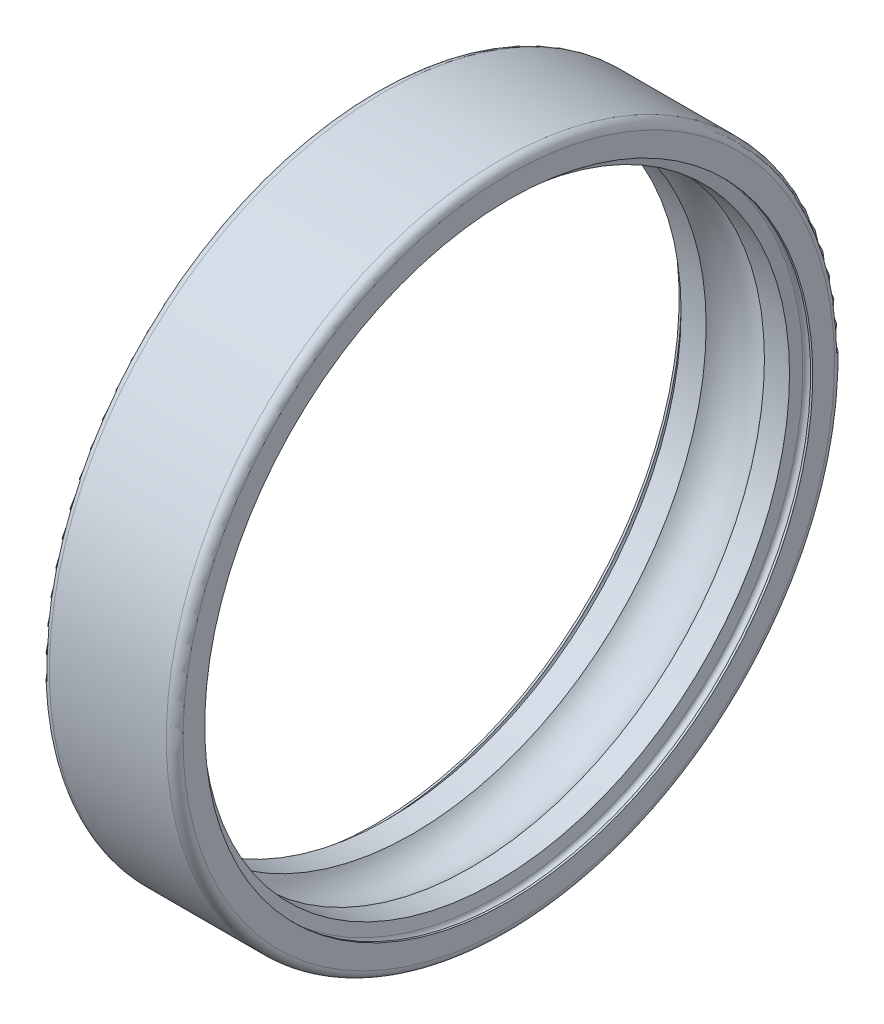
ISO-10303-21;
HEADER;
FILE_DESCRIPTION(('STEP AP214'),'2;1');
FILE_NAME('part.step','',(''),(''),'','','');
FILE_SCHEMA(('AUTOMOTIVE_DESIGN { 1 0 10303 214 1 1 1 1 }'));
ENDSEC;
DATA;
#1=APPLICATION_CONTEXT('core data for automotive mechanical design processes');
#2=APPLICATION_PROTOCOL_DEFINITION('international standard','automotive_design',2000,#1);
#3=PRODUCT_CONTEXT('',#1,'mechanical');
#4=PRODUCT('Part','Part','',(#3));
#5=PRODUCT_RELATED_PRODUCT_CATEGORY('part','',(#4));
#6=PRODUCT_DEFINITION_FORMATION('','',#4);
#7=PRODUCT_DEFINITION_CONTEXT('part definition',#1,'design');
#8=PRODUCT_DEFINITION('design','',#6,#7);
#9=PRODUCT_DEFINITION_SHAPE('','',#8);
#10=(LENGTH_UNIT() NAMED_UNIT(*) SI_UNIT(.MILLI.,.METRE.));
#11=(NAMED_UNIT(*) PLANE_ANGLE_UNIT() SI_UNIT($,.RADIAN.));
#12=(NAMED_UNIT(*) SI_UNIT($,.STERADIAN.) SOLID_ANGLE_UNIT());
#13=UNCERTAINTY_MEASURE_WITH_UNIT(LENGTH_MEASURE(1.E-05),#10,'distance_accuracy_value','');
#14=(GEOMETRIC_REPRESENTATION_CONTEXT(3) GLOBAL_UNCERTAINTY_ASSIGNED_CONTEXT((#13)) GLOBAL_UNIT_ASSIGNED_CONTEXT((#10,
#11,#12)) REPRESENTATION_CONTEXT('',''));
#15=CARTESIAN_POINT('',(0.,0.,0.));
#16=DIRECTION('',(0.,0.,1.));
#17=DIRECTION('',(1.,0.,0.));
#18=AXIS2_PLACEMENT_3D('',#15,#16,#17);
#19=CARTESIAN_POINT('',(15.235,0.,0.));
#20=DIRECTION('',(1.,0.,0.));
#21=DIRECTION('',(0.,0.,-1.));
#22=AXIS2_PLACEMENT_3D('',#19,#20,#21);
#23=TOROIDAL_SURFACE('',#22,36.4,0.51);
#24=CARTESIAN_POINT('',(15.745,0.,0.));
#25=DIRECTION('',(1.,0.,0.));
#26=DIRECTION('',(0.,1.,0.));
#27=AXIS2_PLACEMENT_3D('',#24,#25,#26);
#28=CIRCLE('',#27,36.4);
#29=CARTESIAN_POINT('',(15.745,36.4,0.));
#30=VERTEX_POINT('',#29);
#31=EDGE_CURVE('E11',#30,#30,#28,.T.);
#32=ORIENTED_EDGE('',*,*,#31,.T.);
#33=EDGE_LOOP('',(#32));
#34=FACE_BOUND('',#33,.T.);
#35=CARTESIAN_POINT('',(14.7327480459638,0.,0.));
#36=DIRECTION('',(1.,0.,0.));
#37=DIRECTION('',(0.,1.,0.));
#38=AXIS2_PLACEMENT_3D('',#35,#36,#37);
#39=CIRCLE('',#38,36.4885605706102);
#40=CARTESIAN_POINT('',(14.7327480459638,36.4885605706102,0.));
#41=VERTEX_POINT('',#40);
#42=EDGE_CURVE('E59',#41,#41,#39,.T.);
#43=ORIENTED_EDGE('',*,*,#42,.F.);
#44=EDGE_LOOP('',(#43));
#45=FACE_BOUND('',#44,.T.);
#46=ADVANCED_FACE('F16',(#34,#45),#23,.F.);
#47=CARTESIAN_POINT('',(15.8725,0.,0.));
#48=DIRECTION('',(-1.,0.,0.));
#49=DIRECTION('',(0.,1.,0.));
#50=AXIS2_PLACEMENT_3D('',#47,#48,#49);
#51=CYLINDRICAL_SURFACE('',#50,36.4);
#52=CARTESIAN_POINT('',(16.,0.,0.));
#53=DIRECTION('',(1.,0.,0.));
#54=DIRECTION('',(0.,1.,0.));
#55=AXIS2_PLACEMENT_3D('',#52,#53,#54);
#56=CIRCLE('',#55,36.4);
#57=CARTESIAN_POINT('',(16.,36.4,0.));
#58=VERTEX_POINT('',#57);
#59=EDGE_CURVE('E20',#58,#58,#56,.T.);
#60=ORIENTED_EDGE('',*,*,#59,.T.);
#61=EDGE_LOOP('',(#60));
#62=FACE_BOUND('',#61,.T.);
#63=ORIENTED_EDGE('',*,*,#31,.F.);
#64=EDGE_LOOP('',(#63));
#65=FACE_BOUND('',#64,.T.);
#66=ADVANCED_FACE('F18',(#62,#65),#51,.F.);
#67=CARTESIAN_POINT('',(16.,37.7,0.));
#68=DIRECTION('',(1.,0.,0.));
#69=DIRECTION('',(0.,1.,0.));
#70=AXIS2_PLACEMENT_3D('',#67,#68,#69);
#71=PLANE('',#70);
#72=CARTESIAN_POINT('',(16.,0.,0.));
#73=DIRECTION('',(1.,0.,0.));
#74=DIRECTION('',(0.,1.,0.));
#75=AXIS2_PLACEMENT_3D('',#72,#73,#74);
#76=CIRCLE('',#75,39.);
#77=CARTESIAN_POINT('',(16.,39.,0.));
#78=VERTEX_POINT('',#77);
#79=EDGE_CURVE('E89',#78,#78,#76,.T.);
#80=ORIENTED_EDGE('',*,*,#79,.T.);
#81=EDGE_LOOP('',(#80));
#82=FACE_BOUND('',#81,.T.);
#83=ORIENTED_EDGE('',*,*,#59,.F.);
#84=EDGE_LOOP('',(#83));
#85=FACE_BOUND('',#84,.T.);
#86=ADVANCED_FACE('F125',(#82,#85),#71,.T.);
#87=CARTESIAN_POINT('',(15.,0.,0.));
#88=DIRECTION('',(1.,0.,0.));
#89=DIRECTION('',(0.,0.,-1.));
#90=AXIS2_PLACEMENT_3D('',#87,#88,#89);
#91=TOROIDAL_SURFACE('',#90,39.,1.);
#92=CARTESIAN_POINT('',(15.,0.,0.));
#93=DIRECTION('',(1.,0.,0.));
#94=DIRECTION('',(0.,1.,0.));
#95=AXIS2_PLACEMENT_3D('',#92,#93,#94);
#96=CIRCLE('',#95,40.);
#97=CARTESIAN_POINT('',(15.,40.,0.));
#98=VERTEX_POINT('',#97);
#99=EDGE_CURVE('E90',#98,#98,#96,.T.);
#100=ORIENTED_EDGE('',*,*,#99,.T.);
#101=EDGE_LOOP('',(#100));
#102=FACE_BOUND('',#101,.T.);
#103=ORIENTED_EDGE('',*,*,#79,.F.);
#104=EDGE_LOOP('',(#103));
#105=FACE_BOUND('',#104,.T.);
#106=ADVANCED_FACE('F139',(#102,#105),#91,.T.);
#107=CARTESIAN_POINT('',(8.,0.,0.));
#108=DIRECTION('',(-1.,0.,0.));
#109=DIRECTION('',(0.,1.,0.));
#110=AXIS2_PLACEMENT_3D('',#107,#108,#109);
#111=CYLINDRICAL_SURFACE('',#110,40.);
#112=CARTESIAN_POINT('',(1.,0.,0.));
#113=DIRECTION('',(1.,0.,0.));
#114=DIRECTION('',(0.,1.,0.));
#115=AXIS2_PLACEMENT_3D('',#112,#113,#114);
#116=CIRCLE('',#115,40.);
#117=CARTESIAN_POINT('',(1.,40.,0.));
#118=VERTEX_POINT('',#117);
#119=EDGE_CURVE('E78',#118,#118,#116,.T.);
#120=ORIENTED_EDGE('',*,*,#119,.T.);
#121=EDGE_LOOP('',(#120));
#122=FACE_BOUND('',#121,.T.);
#123=ORIENTED_EDGE('',*,*,#99,.F.);
#124=EDGE_LOOP('',(#123));
#125=FACE_BOUND('',#124,.T.);
#126=ADVANCED_FACE('F133',(#122,#125),#111,.T.);
#127=CARTESIAN_POINT('',(1.,0.,0.));
#128=DIRECTION('',(1.,0.,0.));
#129=DIRECTION('',(0.,0.,-1.));
#130=AXIS2_PLACEMENT_3D('',#127,#128,#129);
#131=TOROIDAL_SURFACE('',#130,39.,1.);
#132=CARTESIAN_POINT('',(0.,0.,0.));
#133=DIRECTION('',(1.,0.,0.));
#134=DIRECTION('',(0.,1.,0.));
#135=AXIS2_PLACEMENT_3D('',#132,#133,#134);
#136=CIRCLE('',#135,39.);
#137=CARTESIAN_POINT('',(0.,39.,0.));
#138=VERTEX_POINT('',#137);
#139=EDGE_CURVE('E76',#138,#138,#136,.T.);
#140=ORIENTED_EDGE('',*,*,#139,.T.);
#141=EDGE_LOOP('',(#140));
#142=FACE_BOUND('',#141,.T.);
#143=ORIENTED_EDGE('',*,*,#119,.F.);
#144=EDGE_LOOP('',(#143));
#145=FACE_BOUND('',#144,.T.);
#146=ADVANCED_FACE('F130',(#142,#145),#131,.T.);
#147=CARTESIAN_POINT('',(0.,37.7,0.));
#148=DIRECTION('',(-1.,0.,0.));
#149=DIRECTION('',(0.,-1.,0.));
#150=AXIS2_PLACEMENT_3D('',#147,#148,#149);
#151=PLANE('',#150);
#152=CARTESIAN_POINT('',(0.,0.,0.));
#153=DIRECTION('',(1.,0.,0.));
#154=DIRECTION('',(0.,1.,0.));
#155=AXIS2_PLACEMENT_3D('',#152,#153,#154);
#156=CIRCLE('',#155,36.4);
#157=CARTESIAN_POINT('',(0.,36.4,0.));
#158=VERTEX_POINT('',#157);
#159=EDGE_CURVE('E72',#158,#158,#156,.T.);
#160=ORIENTED_EDGE('',*,*,#159,.T.);
#161=EDGE_LOOP('',(#160));
#162=FACE_BOUND('',#161,.T.);
#163=ORIENTED_EDGE('',*,*,#139,.F.);
#164=EDGE_LOOP('',(#163));
#165=FACE_BOUND('',#164,.T.);
#166=ADVANCED_FACE('F73',(#162,#165),#151,.T.);
#167=CARTESIAN_POINT('',(0.1275,0.,0.));
#168=DIRECTION('',(-1.,0.,0.));
#169=DIRECTION('',(0.,1.,0.));
#170=AXIS2_PLACEMENT_3D('',#167,#168,#169);
#171=CYLINDRICAL_SURFACE('',#170,36.4);
#172=CARTESIAN_POINT('',(0.255,0.,0.));
#173=DIRECTION('',(1.,0.,0.));
#174=DIRECTION('',(0.,1.,0.));
#175=AXIS2_PLACEMENT_3D('',#172,#173,#174);
#176=CIRCLE('',#175,36.4);
#177=CARTESIAN_POINT('',(0.255,36.4,0.));
#178=VERTEX_POINT('',#177);
#179=EDGE_CURVE('E77',#178,#178,#176,.T.);
#180=ORIENTED_EDGE('',*,*,#179,.T.);
#181=EDGE_LOOP('',(#180));
#182=FACE_BOUND('',#181,.T.);
#183=ORIENTED_EDGE('',*,*,#159,.F.);
#184=EDGE_LOOP('',(#183));
#185=FACE_BOUND('',#184,.T.);
#186=ADVANCED_FACE('F116',(#182,#185),#171,.F.);
#187=CARTESIAN_POINT('',(0.765,0.,0.));
#188=DIRECTION('',(1.,0.,0.));
#189=DIRECTION('',(0.,0.,-1.));
#190=AXIS2_PLACEMENT_3D('',#187,#188,#189);
#191=TOROIDAL_SURFACE('',#190,36.4,0.51);
#192=CARTESIAN_POINT('',(1.26725195403622,0.,0.));
#193=DIRECTION('',(1.,0.,0.));
#194=DIRECTION('',(0.,1.,0.));
#195=AXIS2_PLACEMENT_3D('',#192,#193,#194);
#196=CIRCLE('',#195,36.4885605706102);
#197=CARTESIAN_POINT('',(1.26725195403622,36.4885605706102,0.));
#198=VERTEX_POINT('',#197);
#199=EDGE_CURVE('E80',#198,#198,#196,.T.);
#200=ORIENTED_EDGE('',*,*,#199,.T.);
#201=EDGE_LOOP('',(#200));
#202=FACE_BOUND('',#201,.T.);
#203=ORIENTED_EDGE('',*,*,#179,.F.);
#204=EDGE_LOOP('',(#203));
#205=FACE_BOUND('',#204,.T.);
#206=ADVANCED_FACE('F100',(#202,#205),#191,.F.);
#207=CARTESIAN_POINT('',(1.38746821325062,0.,0.));
#208=DIRECTION('',(-1.,0.,0.));
#209=DIRECTION('',(0.,1.,0.));
#210=AXIS2_PLACEMENT_3D('',#207,#208,#209);
#211=CONICAL_SURFACE('',#210,35.806780285305,1.39626340159546);
#212=CARTESIAN_POINT('',(1.50768447246502,0.,0.));
#213=DIRECTION('',(1.,0.,0.));
#214=DIRECTION('',(0.,1.,0.));
#215=AXIS2_PLACEMENT_3D('',#212,#213,#214);
#216=CIRCLE('',#215,35.125);
#217=CARTESIAN_POINT('',(1.50768447246502,35.125,0.));
#218=VERTEX_POINT('',#217);
#219=EDGE_CURVE('E83',#218,#218,#216,.T.);
#220=ORIENTED_EDGE('',*,*,#219,.T.);
#221=EDGE_LOOP('',(#220));
#222=FACE_BOUND('',#221,.T.);
#223=ORIENTED_EDGE('',*,*,#199,.F.);
#224=EDGE_LOOP('',(#223));
#225=FACE_BOUND('',#224,.T.);
#226=ADVANCED_FACE('F103',(#222,#225),#211,.F.);
#227=CARTESIAN_POINT('',(3.00978337469716,0.,0.));
#228=DIRECTION('',(-1.,0.,0.));
#229=DIRECTION('',(0.,1.,0.));
#230=AXIS2_PLACEMENT_3D('',#227,#228,#229);
#231=CYLINDRICAL_SURFACE('',#230,35.125);
#232=CARTESIAN_POINT('',(4.51188227692929,0.,0.));
#233=DIRECTION('',(1.,0.,0.));
#234=DIRECTION('',(0.,1.,0.));
#235=AXIS2_PLACEMENT_3D('',#232,#233,#234);
#236=CIRCLE('',#235,35.125);
#237=CARTESIAN_POINT('',(4.51188227692929,35.125,0.));
#238=VERTEX_POINT('',#237);
#239=EDGE_CURVE('E84',#238,#238,#236,.T.);
#240=ORIENTED_EDGE('',*,*,#239,.T.);
#241=EDGE_LOOP('',(#240));
#242=FACE_BOUND('',#241,.T.);
#243=ORIENTED_EDGE('',*,*,#219,.F.);
#244=EDGE_LOOP('',(#243));
#245=FACE_BOUND('',#244,.T.);
#246=ADVANCED_FACE('F105',(#242,#245),#231,.F.);
#247=CARTESIAN_POINT('',(8.,0.,0.));
#248=DIRECTION('',(1.,0.,0.));
#249=DIRECTION('',(0.,0.,-1.));
#250=AXIS2_PLACEMENT_3D('',#247,#248,#249);
#251=TOROIDAL_SURFACE('',#250,32.5,4.3655);
#252=CARTESIAN_POINT('',(11.4881177230707,0.,0.));
#253=DIRECTION('',(1.,0.,0.));
#254=DIRECTION('',(0.,1.,0.));
#255=AXIS2_PLACEMENT_3D('',#252,#253,#254);
#256=CIRCLE('',#255,35.125);
#257=CARTESIAN_POINT('',(11.4881177230707,35.125,0.));
#258=VERTEX_POINT('',#257);
#259=EDGE_CURVE('E88',#258,#258,#256,.T.);
#260=ORIENTED_EDGE('',*,*,#259,.T.);
#261=EDGE_LOOP('',(#260));
#262=FACE_BOUND('',#261,.T.);
#263=ORIENTED_EDGE('',*,*,#239,.F.);
#264=EDGE_LOOP('',(#263));
#265=FACE_BOUND('',#264,.T.);
#266=ADVANCED_FACE('F113',(#262,#265),#251,.F.);
#267=CARTESIAN_POINT('',(12.9902166253028,0.,0.));
#268=DIRECTION('',(-1.,0.,0.));
#269=DIRECTION('',(0.,1.,0.));
#270=AXIS2_PLACEMENT_3D('',#267,#268,#269);
#271=CYLINDRICAL_SURFACE('',#270,35.125);
#272=CARTESIAN_POINT('',(14.492315527535,0.,0.));
#273=DIRECTION('',(1.,0.,0.));
#274=DIRECTION('',(0.,1.,0.));
#275=AXIS2_PLACEMENT_3D('',#272,#273,#274);
#276=CIRCLE('',#275,35.125);
#277=CARTESIAN_POINT('',(14.492315527535,35.125,0.));
#278=VERTEX_POINT('',#277);
#279=EDGE_CURVE('E65',#278,#278,#276,.T.);
#280=ORIENTED_EDGE('',*,*,#279,.T.);
#281=EDGE_LOOP('',(#280));
#282=FACE_BOUND('',#281,.T.);
#283=ORIENTED_EDGE('',*,*,#259,.F.);
#284=EDGE_LOOP('',(#283));
#285=FACE_BOUND('',#284,.T.);
#286=ADVANCED_FACE('F137',(#282,#285),#271,.F.);
#287=CARTESIAN_POINT('',(14.6125317867494,0.,0.));
#288=DIRECTION('',(1.,0.,0.));
#289=DIRECTION('',(0.,1.,0.));
#290=AXIS2_PLACEMENT_3D('',#287,#288,#289);
#291=CONICAL_SURFACE('',#290,35.806780285305,1.39626340159546);
#292=ORIENTED_EDGE('',*,*,#42,.T.);
#293=EDGE_LOOP('',(#292));
#294=FACE_BOUND('',#293,.T.);
#295=ORIENTED_EDGE('',*,*,#279,.F.);
#296=EDGE_LOOP('',(#295));
#297=FACE_BOUND('',#296,.T.);
#298=ADVANCED_FACE('F135',(#294,#297),#291,.F.);
#299=CLOSED_SHELL('',(#46,#66,#86,#106,#126,#146,#166,#186,#206,#226,#246,#266,#286,#298));
#300=MANIFOLD_SOLID_BREP('B1',#299);
#301=ADVANCED_BREP_SHAPE_REPRESENTATION('',(#18,#300),#14);
#302=SHAPE_DEFINITION_REPRESENTATION(#9,#301);
ENDSEC;
END-ISO-10303-21;
